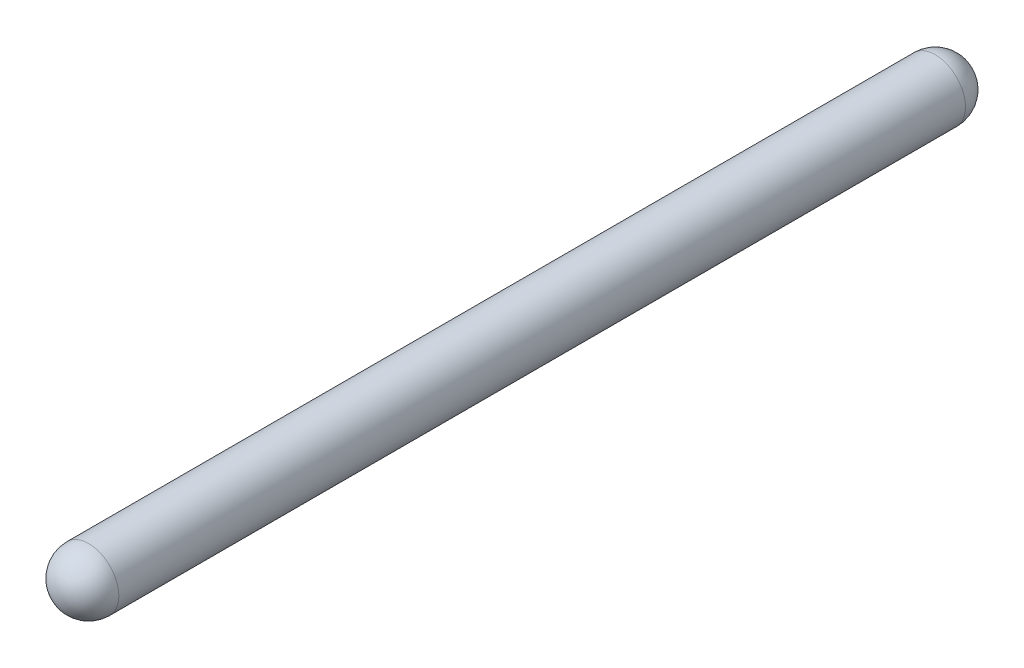
ISO-10303-21;
HEADER;
FILE_DESCRIPTION(('STEP AP214'),'2;1');
FILE_NAME('part.step','',(''),(''),'','','');
FILE_SCHEMA(('AUTOMOTIVE_DESIGN { 1 0 10303 214 1 1 1 1 }'));
ENDSEC;
DATA;
#1=APPLICATION_CONTEXT('core data for automotive mechanical design processes');
#2=APPLICATION_PROTOCOL_DEFINITION('international standard','automotive_design',2000,#1);
#3=PRODUCT_CONTEXT('',#1,'mechanical');
#4=PRODUCT('Part','Part','',(#3));
#5=PRODUCT_RELATED_PRODUCT_CATEGORY('part','',(#4));
#6=PRODUCT_DEFINITION_FORMATION('','',#4);
#7=PRODUCT_DEFINITION_CONTEXT('part definition',#1,'design');
#8=PRODUCT_DEFINITION('design','',#6,#7);
#9=PRODUCT_DEFINITION_SHAPE('','',#8);
#10=(LENGTH_UNIT() NAMED_UNIT(*) SI_UNIT(.MILLI.,.METRE.));
#11=(NAMED_UNIT(*) PLANE_ANGLE_UNIT() SI_UNIT($,.RADIAN.));
#12=(NAMED_UNIT(*) SI_UNIT($,.STERADIAN.) SOLID_ANGLE_UNIT());
#13=UNCERTAINTY_MEASURE_WITH_UNIT(LENGTH_MEASURE(1.E-05),#10,'distance_accuracy_value','');
#14=(GEOMETRIC_REPRESENTATION_CONTEXT(3) GLOBAL_UNCERTAINTY_ASSIGNED_CONTEXT((#13)) GLOBAL_UNIT_ASSIGNED_CONTEXT((#10,
#11,#12)) REPRESENTATION_CONTEXT('',''));
#15=CARTESIAN_POINT('',(0.,0.,0.));
#16=DIRECTION('',(0.,0.,1.));
#17=DIRECTION('',(1.,0.,0.));
#18=AXIS2_PLACEMENT_3D('',#15,#16,#17);
#19=CARTESIAN_POINT('',(0.,0.,30.));
#20=DIRECTION('',(0.,0.,-1.));
#21=DIRECTION('',(-1.,0.,0.));
#22=AXIS2_PLACEMENT_3D('',#19,#20,#21);
#23=CYLINDRICAL_SURFACE('',#22,1.);
#24=CARTESIAN_POINT('',(0.,0.,1.));
#25=DIRECTION('',(0.,0.,-1.));
#26=DIRECTION('',(-1.,0.,0.));
#27=AXIS2_PLACEMENT_3D('',#24,#25,#26);
#28=CIRCLE('',#27,1.);
#29=CARTESIAN_POINT('',(-1.,0.,1.));
#30=VERTEX_POINT('',#29);
#31=EDGE_CURVE('E10',#30,#30,#28,.F.);
#32=ORIENTED_EDGE('',*,*,#31,.T.);
#33=EDGE_LOOP('',(#32));
#34=FACE_BOUND('',#33,.T.);
#35=CARTESIAN_POINT('',(0.,0.,29.));
#36=DIRECTION('',(0.,0.,-1.));
#37=DIRECTION('',(-1.,0.,0.));
#38=AXIS2_PLACEMENT_3D('',#35,#36,#37);
#39=CIRCLE('',#38,1.);
#40=CARTESIAN_POINT('',(-1.,0.,29.));
#41=VERTEX_POINT('',#40);
#42=EDGE_CURVE('E37',#41,#41,#39,.T.);
#43=ORIENTED_EDGE('',*,*,#42,.T.);
#44=EDGE_LOOP('',(#43));
#45=FACE_BOUND('',#44,.T.);
#46=ADVANCED_FACE('F30',(#34,#45),#23,.T.);
#47=CARTESIAN_POINT('',(0.,0.,1.));
#48=DIRECTION('',(0.,0.,1.));
#49=DIRECTION('',(1.,0.,0.));
#50=AXIS2_PLACEMENT_3D('',#47,#48,#49);
#51=SPHERICAL_SURFACE('',#50,1.);
#52=ORIENTED_EDGE('',*,*,#31,.F.);
#53=EDGE_LOOP('',(#52));
#54=FACE_BOUND('',#53,.T.);
#55=ADVANCED_FACE('F45',(#54),#51,.T.);
#56=CARTESIAN_POINT('',(0.,0.,29.));
#57=DIRECTION('',(0.,0.,1.));
#58=DIRECTION('',(1.,0.,0.));
#59=AXIS2_PLACEMENT_3D('',#56,#57,#58);
#60=SPHERICAL_SURFACE('',#59,1.);
#61=ORIENTED_EDGE('',*,*,#42,.F.);
#62=EDGE_LOOP('',(#61));
#63=FACE_BOUND('',#62,.T.);
#64=ADVANCED_FACE('F32',(#63),#60,.T.);
#65=CLOSED_SHELL('',(#46,#55,#64));
#66=MANIFOLD_SOLID_BREP('B2',#65);
#67=ADVANCED_BREP_SHAPE_REPRESENTATION('',(#18,#66),#14);
#68=SHAPE_DEFINITION_REPRESENTATION(#9,#67);
ENDSEC;
END-ISO-10303-21;
